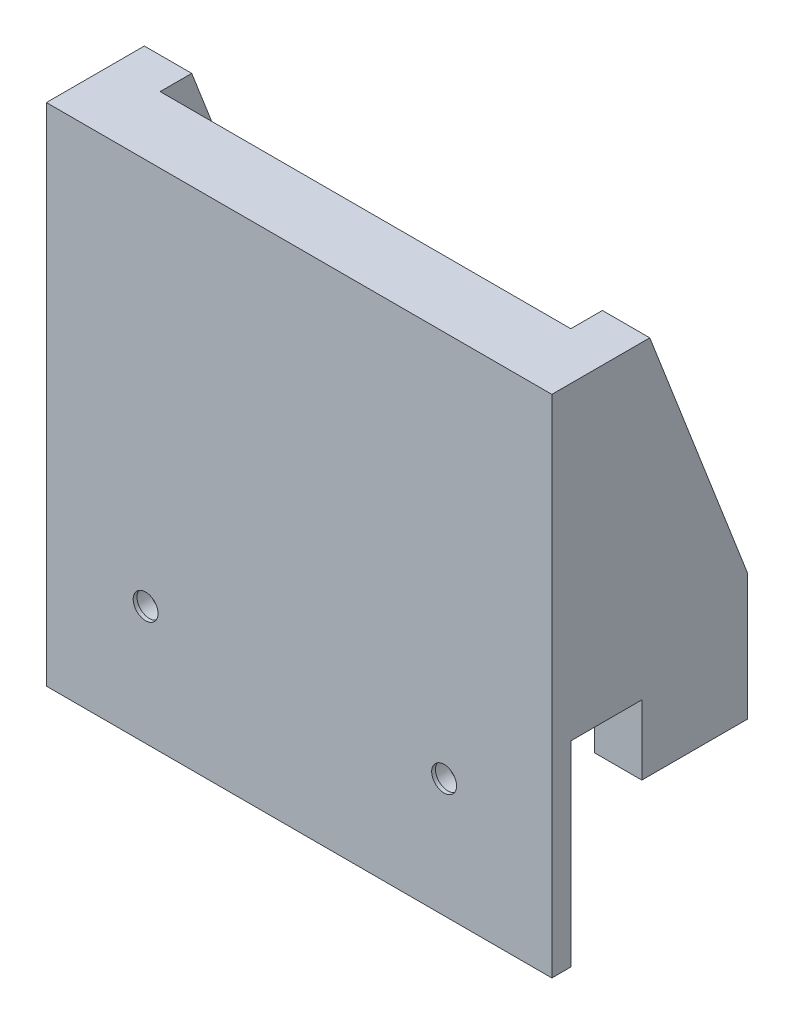
ISO-10303-21;
HEADER;
FILE_DESCRIPTION(('STEP AP214'),'2;1');
FILE_NAME('part.step','',(''),(''),'','','');
FILE_SCHEMA(('AUTOMOTIVE_DESIGN { 1 0 10303 214 1 1 1 1 }'));
ENDSEC;
DATA;
#1=APPLICATION_CONTEXT('core data for automotive mechanical design processes');
#2=APPLICATION_PROTOCOL_DEFINITION('international standard','automotive_design',2000,#1);
#3=PRODUCT_CONTEXT('',#1,'mechanical');
#4=PRODUCT('Part','Part','',(#3));
#5=PRODUCT_RELATED_PRODUCT_CATEGORY('part','',(#4));
#6=PRODUCT_DEFINITION_FORMATION('','',#4);
#7=PRODUCT_DEFINITION_CONTEXT('part definition',#1,'design');
#8=PRODUCT_DEFINITION('design','',#6,#7);
#9=PRODUCT_DEFINITION_SHAPE('','',#8);
#10=(LENGTH_UNIT() NAMED_UNIT(*) SI_UNIT(.MILLI.,.METRE.));
#11=(NAMED_UNIT(*) PLANE_ANGLE_UNIT() SI_UNIT($,.RADIAN.));
#12=(NAMED_UNIT(*) SI_UNIT($,.STERADIAN.) SOLID_ANGLE_UNIT());
#13=UNCERTAINTY_MEASURE_WITH_UNIT(LENGTH_MEASURE(1.E-05),#10,'distance_accuracy_value','');
#14=(GEOMETRIC_REPRESENTATION_CONTEXT(3) GLOBAL_UNCERTAINTY_ASSIGNED_CONTEXT((#13)) GLOBAL_UNIT_ASSIGNED_CONTEXT((#10,
#11,#12)) REPRESENTATION_CONTEXT('',''));
#15=CARTESIAN_POINT('',(0.,0.,0.));
#16=DIRECTION('',(0.,0.,1.));
#17=DIRECTION('',(1.,0.,0.));
#18=AXIS2_PLACEMENT_3D('',#15,#16,#17);
#19=CARTESIAN_POINT('',(0.,0.,-9.525));
#20=DIRECTION('',(0.,0.,-1.));
#21=DIRECTION('',(-1.,0.,0.));
#22=AXIS2_PLACEMENT_3D('',#19,#20,#21);
#23=PLANE('',#22);
#24=DIRECTION('',(-1.,0.,0.));
#25=VECTOR('',#24,1.);
#26=CARTESIAN_POINT('',(0.,39.37,-9.525));
#27=LINE('',#26,#25);
#28=CARTESIAN_POINT('',(-9.525,39.37,-9.525));
#29=VERTEX_POINT('',#28);
#30=CARTESIAN_POINT('',(-92.0749999999996,39.3699999999998,-9.525));
#31=VERTEX_POINT('',#30);
#32=EDGE_CURVE('E58',#29,#31,#27,.T.);
#33=ORIENTED_EDGE('',*,*,#32,.T.);
#34=DIRECTION('',(0.,1.,0.));
#35=VECTOR('',#34,1.);
#36=CARTESIAN_POINT('',(-92.0749999999996,39.37,-9.525));
#37=LINE('',#36,#35);
#38=CARTESIAN_POINT('',(-92.0749999999996,101.6,-9.525));
#39=VERTEX_POINT('',#38);
#40=EDGE_CURVE('E53',#31,#39,#37,.T.);
#41=ORIENTED_EDGE('',*,*,#40,.T.);
#42=DIRECTION('',(1.,0.,0.));
#43=VECTOR('',#42,1.);
#44=CARTESIAN_POINT('',(0.,101.6,-9.525));
#45=LINE('',#44,#43);
#46=CARTESIAN_POINT('',(-9.525,101.6,-9.525));
#47=VERTEX_POINT('',#46);
#48=EDGE_CURVE('E39',#39,#47,#45,.T.);
#49=ORIENTED_EDGE('',*,*,#48,.T.);
#50=DIRECTION('',(0.,-1.,0.));
#51=VECTOR('',#50,1.);
#52=CARTESIAN_POINT('',(-9.525,39.37,-9.525));
#53=LINE('',#52,#51);
#54=EDGE_CURVE('E210',#47,#29,#53,.T.);
#55=ORIENTED_EDGE('',*,*,#54,.T.);
#56=EDGE_LOOP('',(#33,#41,#49,#55));
#57=FACE_BOUND('',#56,.T.);
#58=ADVANCED_FACE('F35',(#57),#23,.T.);
#59=CARTESIAN_POINT('',(-101.6,0.,3.81));
#60=DIRECTION('',(1.,0.,0.));
#61=DIRECTION('',(0.,0.,-1.));
#62=AXIS2_PLACEMENT_3D('',#59,#60,#61);
#63=PLANE('',#62);
#64=DIRECTION('',(0.,0.,-1.));
#65=VECTOR('',#64,1.);
#66=CARTESIAN_POINT('',(-101.6,101.6,3.81));
#67=LINE('',#66,#65);
#68=CARTESIAN_POINT('',(-101.6,101.6,3.81));
#69=VERTEX_POINT('',#68);
#70=CARTESIAN_POINT('',(-101.6,101.6,-15.875));
#71=VERTEX_POINT('',#70);
#72=EDGE_CURVE('E315',#69,#71,#67,.T.);
#73=ORIENTED_EDGE('',*,*,#72,.T.);
#74=DIRECTION('',(0.,-0.93260074364217,-0.360909757360578));
#75=VECTOR('',#74,1.);
#76=CARTESIAN_POINT('',(-101.6,101.6,-15.875));
#77=LINE('',#76,#75);
#78=CARTESIAN_POINT('',(-101.6,50.8,-35.5342333846047));
#79=VERTEX_POINT('',#78);
#80=EDGE_CURVE('E156',#71,#79,#77,.T.);
#81=ORIENTED_EDGE('',*,*,#80,.T.);
#82=DIRECTION('',(0.,-1.,0.));
#83=VECTOR('',#82,1.);
#84=CARTESIAN_POINT('',(-101.6,50.8,-35.5342333846047));
#85=LINE('',#84,#83);
#86=CARTESIAN_POINT('',(-101.6,25.4,-35.5342333846047));
#87=VERTEX_POINT('',#86);
#88=EDGE_CURVE('E187',#79,#87,#85,.T.);
#89=ORIENTED_EDGE('',*,*,#88,.T.);
#90=DIRECTION('',(0.,0.,1.));
#91=VECTOR('',#90,1.);
#92=CARTESIAN_POINT('',(-101.6,25.4,-35.5342333846047));
#93=LINE('',#92,#91);
#94=CARTESIAN_POINT('',(-101.6,25.4,-14.2748));
#95=VERTEX_POINT('',#94);
#96=EDGE_CURVE('E190',#87,#95,#93,.T.);
#97=ORIENTED_EDGE('',*,*,#96,.T.);
#98=DIRECTION('',(0.,1.,0.));
#99=VECTOR('',#98,1.);
#100=CARTESIAN_POINT('',(-101.6,25.4,-14.2748));
#101=LINE('',#100,#99);
#102=CARTESIAN_POINT('',(-101.6,39.37,-14.2748));
#103=VERTEX_POINT('',#102);
#104=EDGE_CURVE('E193',#95,#103,#101,.T.);
#105=ORIENTED_EDGE('',*,*,#104,.T.);
#106=DIRECTION('',(0.,0.,1.));
#107=VECTOR('',#106,1.);
#108=CARTESIAN_POINT('',(-101.6,39.3699999999997,-9.525));
#109=LINE('',#108,#107);
#110=CARTESIAN_POINT('',(-101.6,39.3699999999997,0.));
#111=VERTEX_POINT('',#110);
#112=EDGE_CURVE('E270',#103,#111,#109,.T.);
#113=ORIENTED_EDGE('',*,*,#112,.T.);
#114=DIRECTION('',(0.,-1.,0.));
#115=VECTOR('',#114,1.);
#116=CARTESIAN_POINT('',(-101.6,0.,0.));
#117=LINE('',#116,#115);
#118=CARTESIAN_POINT('',(-101.6,0.,0.));
#119=VERTEX_POINT('',#118);
#120=EDGE_CURVE('E305',#111,#119,#117,.T.);
#121=ORIENTED_EDGE('',*,*,#120,.T.);
#122=DIRECTION('',(0.,0.,-1.));
#123=VECTOR('',#122,1.);
#124=CARTESIAN_POINT('',(-101.6,0.,3.81));
#125=LINE('',#124,#123);
#126=CARTESIAN_POINT('',(-101.6,0.,3.81));
#127=VERTEX_POINT('',#126);
#128=EDGE_CURVE('E11',#127,#119,#125,.T.);
#129=ORIENTED_EDGE('',*,*,#128,.F.);
#130=DIRECTION('',(0.,-1.,0.));
#131=VECTOR('',#130,1.);
#132=CARTESIAN_POINT('',(-101.6,0.,3.81));
#133=LINE('',#132,#131);
#134=EDGE_CURVE('E306',#69,#127,#133,.T.);
#135=ORIENTED_EDGE('',*,*,#134,.F.);
#136=EDGE_LOOP('',(#73,#81,#89,#97,#105,#113,#121,#129,#135));
#137=FACE_BOUND('',#136,.T.);
#138=ADVANCED_FACE('F37',(#137),#63,.F.);
#139=CARTESIAN_POINT('',(-101.6,0.,3.81));
#140=DIRECTION('',(0.,1.,0.));
#141=DIRECTION('',(-1.,0.,0.));
#142=AXIS2_PLACEMENT_3D('',#139,#140,#141);
#143=PLANE('',#142);
#144=DIRECTION('',(1.,0.,0.));
#145=VECTOR('',#144,1.);
#146=CARTESIAN_POINT('',(-101.6,0.,0.));
#147=LINE('',#146,#145);
#148=CARTESIAN_POINT('',(0.,0.,0.));
#149=VERTEX_POINT('',#148);
#150=EDGE_CURVE('E318',#119,#149,#147,.T.);
#151=ORIENTED_EDGE('',*,*,#150,.T.);
#152=DIRECTION('',(0.,0.,-1.));
#153=VECTOR('',#152,1.);
#154=CARTESIAN_POINT('',(0.,0.,3.81));
#155=LINE('',#154,#153);
#156=CARTESIAN_POINT('',(0.,0.,3.81));
#157=VERTEX_POINT('',#156);
#158=EDGE_CURVE('E45',#157,#149,#155,.T.);
#159=ORIENTED_EDGE('',*,*,#158,.F.);
#160=DIRECTION('',(1.,0.,0.));
#161=VECTOR('',#160,1.);
#162=CARTESIAN_POINT('',(-101.6,0.,3.81));
#163=LINE('',#162,#161);
#164=EDGE_CURVE('E309',#127,#157,#163,.T.);
#165=ORIENTED_EDGE('',*,*,#164,.F.);
#166=ORIENTED_EDGE('',*,*,#128,.T.);
#167=EDGE_LOOP('',(#151,#159,#165,#166));
#168=FACE_BOUND('',#167,.T.);
#169=ADVANCED_FACE('F363',(#168),#143,.F.);
#170=CARTESIAN_POINT('',(0.,0.,3.81));
#171=DIRECTION('',(-1.,0.,0.));
#172=DIRECTION('',(0.,0.,1.));
#173=AXIS2_PLACEMENT_3D('',#170,#171,#172);
#174=PLANE('',#173);
#175=DIRECTION('',(0.,1.,0.));
#176=VECTOR('',#175,1.);
#177=CARTESIAN_POINT('',(0.,0.,0.));
#178=LINE('',#177,#176);
#179=CARTESIAN_POINT('',(0.,39.3699999999999,0.));
#180=VERTEX_POINT('',#179);
#181=EDGE_CURVE('E267',#149,#180,#178,.T.);
#182=ORIENTED_EDGE('',*,*,#181,.T.);
#183=DIRECTION('',(0.,0.,1.));
#184=VECTOR('',#183,1.);
#185=CARTESIAN_POINT('',(0.,39.37,-9.525));
#186=LINE('',#185,#184);
#187=CARTESIAN_POINT('',(0.,39.37,-14.2748));
#188=VERTEX_POINT('',#187);
#189=EDGE_CURVE('E273',#188,#180,#186,.T.);
#190=ORIENTED_EDGE('',*,*,#189,.F.);
#191=DIRECTION('',(0.,-1.,0.));
#192=VECTOR('',#191,1.);
#193=CARTESIAN_POINT('',(0.,25.4,-14.2748));
#194=LINE('',#193,#192);
#195=CARTESIAN_POINT('',(0.,25.4,-14.2748));
#196=VERTEX_POINT('',#195);
#197=EDGE_CURVE('E199',#188,#196,#194,.T.);
#198=ORIENTED_EDGE('',*,*,#197,.T.);
#199=DIRECTION('',(0.,0.,-1.));
#200=VECTOR('',#199,1.);
#201=CARTESIAN_POINT('',(0.,25.4,-35.5342333846047));
#202=LINE('',#201,#200);
#203=CARTESIAN_POINT('',(0.,25.4,-35.5342333846047));
#204=VERTEX_POINT('',#203);
#205=EDGE_CURVE('E241',#196,#204,#202,.T.);
#206=ORIENTED_EDGE('',*,*,#205,.T.);
#207=DIRECTION('',(0.,1.,0.));
#208=VECTOR('',#207,1.);
#209=CARTESIAN_POINT('',(0.,50.8,-35.5342333846047));
#210=LINE('',#209,#208);
#211=CARTESIAN_POINT('',(0.,50.8,-35.5342333846047));
#212=VERTEX_POINT('',#211);
#213=EDGE_CURVE('E244',#204,#212,#210,.T.);
#214=ORIENTED_EDGE('',*,*,#213,.T.);
#215=DIRECTION('',(0.,0.93260074364217,0.360909757360578));
#216=VECTOR('',#215,1.);
#217=CARTESIAN_POINT('',(0.,101.6,-15.875));
#218=LINE('',#217,#216);
#219=CARTESIAN_POINT('',(0.,101.6,-15.875));
#220=VERTEX_POINT('',#219);
#221=EDGE_CURVE('E214',#212,#220,#218,.T.);
#222=ORIENTED_EDGE('',*,*,#221,.T.);
#223=DIRECTION('',(0.,0.,-1.));
#224=VECTOR('',#223,1.);
#225=CARTESIAN_POINT('',(0.,101.6,3.81));
#226=LINE('',#225,#224);
#227=CARTESIAN_POINT('',(0.,101.6,3.81));
#228=VERTEX_POINT('',#227);
#229=EDGE_CURVE('E322',#228,#220,#226,.T.);
#230=ORIENTED_EDGE('',*,*,#229,.F.);
#231=DIRECTION('',(0.,1.,0.));
#232=VECTOR('',#231,1.);
#233=CARTESIAN_POINT('',(0.,0.,3.81));
#234=LINE('',#233,#232);
#235=EDGE_CURVE('E311',#157,#228,#234,.T.);
#236=ORIENTED_EDGE('',*,*,#235,.F.);
#237=ORIENTED_EDGE('',*,*,#158,.T.);
#238=EDGE_LOOP('',(#182,#190,#198,#206,#214,#222,#230,#236,#237));
#239=FACE_BOUND('',#238,.T.);
#240=ADVANCED_FACE('F336',(#239),#174,.F.);
#241=CARTESIAN_POINT('',(-101.6,101.6,3.81));
#242=DIRECTION('',(0.,-1.,0.));
#243=DIRECTION('',(0.,0.,-1.));
#244=AXIS2_PLACEMENT_3D('',#241,#242,#243);
#245=PLANE('',#244);
#246=ORIENTED_EDGE('',*,*,#229,.T.);
#247=DIRECTION('',(1.,0.,0.));
#248=VECTOR('',#247,1.);
#249=CARTESIAN_POINT('',(-9.525,101.6,-15.875));
#250=LINE('',#249,#248);
#251=CARTESIAN_POINT('',(-9.525,101.6,-15.875));
#252=VERTEX_POINT('',#251);
#253=EDGE_CURVE('E249',#252,#220,#250,.T.);
#254=ORIENTED_EDGE('',*,*,#253,.F.);
#255=DIRECTION('',(0.,0.,1.));
#256=VECTOR('',#255,1.);
#257=CARTESIAN_POINT('',(-9.525,101.6,-9.525));
#258=LINE('',#257,#256);
#259=EDGE_CURVE('E221',#252,#47,#258,.T.);
#260=ORIENTED_EDGE('',*,*,#259,.T.);
#261=ORIENTED_EDGE('',*,*,#48,.F.);
#262=DIRECTION('',(0.,0.,-1.));
#263=VECTOR('',#262,1.);
#264=CARTESIAN_POINT('',(-92.0749999999996,101.6,-9.525));
#265=LINE('',#264,#263);
#266=CARTESIAN_POINT('',(-92.0749999999996,101.6,-15.875));
#267=VERTEX_POINT('',#266);
#268=EDGE_CURVE('E168',#39,#267,#265,.T.);
#269=ORIENTED_EDGE('',*,*,#268,.T.);
#270=DIRECTION('',(-1.,0.,0.));
#271=VECTOR('',#270,1.);
#272=CARTESIAN_POINT('',(-92.0749999999996,101.6,-15.875));
#273=LINE('',#272,#271);
#274=EDGE_CURVE('E151',#267,#71,#273,.T.);
#275=ORIENTED_EDGE('',*,*,#274,.T.);
#276=ORIENTED_EDGE('',*,*,#72,.F.);
#277=DIRECTION('',(-1.,0.,0.));
#278=VECTOR('',#277,1.);
#279=CARTESIAN_POINT('',(-101.6,101.6,3.81));
#280=LINE('',#279,#278);
#281=EDGE_CURVE('E313',#228,#69,#280,.T.);
#282=ORIENTED_EDGE('',*,*,#281,.F.);
#283=EDGE_LOOP('',(#246,#254,#260,#261,#269,#275,#276,#282));
#284=FACE_BOUND('',#283,.T.);
#285=ADVANCED_FACE('F173',(#284),#245,.F.);
#286=CARTESIAN_POINT('',(0.,0.,3.81));
#287=DIRECTION('',(0.,0.,-1.));
#288=DIRECTION('',(-1.,0.,0.));
#289=AXIS2_PLACEMENT_3D('',#286,#287,#288);
#290=PLANE('',#289);
#291=CARTESIAN_POINT('',(-21.6569926395346,23.8648844244175,3.81));
#292=DIRECTION('',(0.,0.,-1.));
#293=DIRECTION('',(-1.,0.,0.));
#294=AXIS2_PLACEMENT_3D('',#291,#292,#293);
#295=CIRCLE('',#294,2.5);
#296=CARTESIAN_POINT('',(-24.1569926395346,23.8648844244175,3.81));
#297=VERTEX_POINT('',#296);
#298=EDGE_CURVE('E288',#297,#297,#295,.T.);
#299=ORIENTED_EDGE('',*,*,#298,.T.);
#300=EDGE_LOOP('',(#299));
#301=FACE_BOUND('',#300,.T.);
#302=CARTESIAN_POINT('',(-81.6598930743401,23.8648844244175,3.81));
#303=DIRECTION('',(0.,0.,-1.));
#304=DIRECTION('',(-1.,0.,0.));
#305=AXIS2_PLACEMENT_3D('',#302,#303,#304);
#306=CIRCLE('',#305,2.5);
#307=CARTESIAN_POINT('',(-84.1598930743401,23.8648844244175,3.81));
#308=VERTEX_POINT('',#307);
#309=EDGE_CURVE('E302',#308,#308,#306,.T.);
#310=ORIENTED_EDGE('',*,*,#309,.T.);
#311=EDGE_LOOP('',(#310));
#312=FACE_BOUND('',#311,.T.);
#313=ORIENTED_EDGE('',*,*,#134,.T.);
#314=ORIENTED_EDGE('',*,*,#164,.T.);
#315=ORIENTED_EDGE('',*,*,#235,.T.);
#316=ORIENTED_EDGE('',*,*,#281,.T.);
#317=EDGE_LOOP('',(#313,#314,#315,#316));
#318=FACE_BOUND('',#317,.T.);
#319=ADVANCED_FACE('F331',(#301,#312,#318),#290,.F.);
#320=CARTESIAN_POINT('',(0.,0.,0.));
#321=DIRECTION('',(0.,0.,-1.));
#322=DIRECTION('',(-1.,0.,0.));
#323=AXIS2_PLACEMENT_3D('',#320,#321,#322);
#324=PLANE('',#323);
#325=DIRECTION('',(-1.,0.,0.));
#326=VECTOR('',#325,1.);
#327=CARTESIAN_POINT('',(0.,39.37,0.));
#328=LINE('',#327,#326);
#329=EDGE_CURVE('E251',#180,#111,#328,.T.);
#330=ORIENTED_EDGE('',*,*,#329,.F.);
#331=ORIENTED_EDGE('',*,*,#181,.F.);
#332=ORIENTED_EDGE('',*,*,#150,.F.);
#333=ORIENTED_EDGE('',*,*,#120,.F.);
#334=EDGE_LOOP('',(#330,#331,#332,#333));
#335=FACE_BOUND('',#334,.T.);
#336=CARTESIAN_POINT('',(-21.6569926395346,23.8648844244175,0.));
#337=DIRECTION('',(0.,0.,-1.));
#338=DIRECTION('',(-1.,0.,0.));
#339=AXIS2_PLACEMENT_3D('',#336,#337,#338);
#340=CIRCLE('',#339,3.);
#341=CARTESIAN_POINT('',(-24.6569926395346,23.8648844244175,0.));
#342=VERTEX_POINT('',#341);
#343=EDGE_CURVE('E261',#342,#342,#340,.T.);
#344=ORIENTED_EDGE('',*,*,#343,.F.);
#345=EDGE_LOOP('',(#344));
#346=FACE_BOUND('',#345,.T.);
#347=CARTESIAN_POINT('',(-81.6598930743401,23.8648844244175,0.));
#348=DIRECTION('',(0.,0.,-1.));
#349=DIRECTION('',(-1.,0.,0.));
#350=AXIS2_PLACEMENT_3D('',#347,#348,#349);
#351=CIRCLE('',#350,2.99999999999999);
#352=CARTESIAN_POINT('',(-84.6598930743401,23.8648844244175,0.));
#353=VERTEX_POINT('',#352);
#354=EDGE_CURVE('E293',#353,#353,#351,.T.);
#355=ORIENTED_EDGE('',*,*,#354,.F.);
#356=EDGE_LOOP('',(#355));
#357=FACE_BOUND('',#356,.T.);
#358=ADVANCED_FACE('F392',(#335,#346,#357),#324,.T.);
#359=CARTESIAN_POINT('',(-81.6598930743401,23.8648844244175,0.));
#360=DIRECTION('',(0.,0.,-1.));
#361=DIRECTION('',(-1.,0.,0.));
#362=AXIS2_PLACEMENT_3D('',#359,#360,#361);
#363=CYLINDRICAL_SURFACE('',#362,2.5);
#364=ORIENTED_EDGE('',*,*,#309,.F.);
#365=EDGE_LOOP('',(#364));
#366=FACE_BOUND('',#365,.T.);
#367=CARTESIAN_POINT('',(-81.6598930743401,23.8648844244175,3.048));
#368=DIRECTION('',(0.,0.,-1.));
#369=DIRECTION('',(-1.,0.,0.));
#370=AXIS2_PLACEMENT_3D('',#367,#368,#369);
#371=CIRCLE('',#370,2.5);
#372=CARTESIAN_POINT('',(-84.1598930743401,23.8648844244175,3.048));
#373=VERTEX_POINT('',#372);
#374=EDGE_CURVE('E299',#373,#373,#371,.T.);
#375=ORIENTED_EDGE('',*,*,#374,.T.);
#376=EDGE_LOOP('',(#375));
#377=FACE_BOUND('',#376,.T.);
#378=ADVANCED_FACE('F388',(#366,#377),#363,.F.);
#379=CARTESIAN_POINT('',(-79.1598930743401,23.8648844244175,3.048));
#380=DIRECTION('',(0.,0.,1.));
#381=DIRECTION('',(1.,0.,0.));
#382=AXIS2_PLACEMENT_3D('',#379,#380,#381);
#383=PLANE('',#382);
#384=ORIENTED_EDGE('',*,*,#374,.F.);
#385=EDGE_LOOP('',(#384));
#386=FACE_BOUND('',#385,.T.);
#387=CARTESIAN_POINT('',(-81.6598930743401,23.8648844244175,3.048));
#388=DIRECTION('',(0.,0.,-1.));
#389=DIRECTION('',(-1.,0.,0.));
#390=AXIS2_PLACEMENT_3D('',#387,#388,#389);
#391=CIRCLE('',#390,3.);
#392=CARTESIAN_POINT('',(-84.6598930743401,23.8648844244175,3.048));
#393=VERTEX_POINT('',#392);
#394=EDGE_CURVE('E296',#393,#393,#391,.T.);
#395=ORIENTED_EDGE('',*,*,#394,.T.);
#396=EDGE_LOOP('',(#395));
#397=FACE_BOUND('',#396,.T.);
#398=ADVANCED_FACE('F384',(#386,#397),#383,.F.);
#399=CARTESIAN_POINT('',(-81.6598930743401,23.8648844244175,0.));
#400=DIRECTION('',(0.,0.,-1.));
#401=DIRECTION('',(-1.,0.,0.));
#402=AXIS2_PLACEMENT_3D('',#399,#400,#401);
#403=CYLINDRICAL_SURFACE('',#402,3.);
#404=ORIENTED_EDGE('',*,*,#394,.F.);
#405=EDGE_LOOP('',(#404));
#406=FACE_BOUND('',#405,.T.);
#407=ORIENTED_EDGE('',*,*,#354,.T.);
#408=EDGE_LOOP('',(#407));
#409=FACE_BOUND('',#408,.T.);
#410=ADVANCED_FACE('F380',(#406,#409),#403,.F.);
#411=CARTESIAN_POINT('',(-21.6569926395346,23.8648844244175,0.));
#412=DIRECTION('',(0.,0.,-1.));
#413=DIRECTION('',(-1.,0.,0.));
#414=AXIS2_PLACEMENT_3D('',#411,#412,#413);
#415=CYLINDRICAL_SURFACE('',#414,2.5);
#416=ORIENTED_EDGE('',*,*,#298,.F.);
#417=EDGE_LOOP('',(#416));
#418=FACE_BOUND('',#417,.T.);
#419=CARTESIAN_POINT('',(-21.6569926395346,23.8648844244175,3.048));
#420=DIRECTION('',(0.,0.,-1.));
#421=DIRECTION('',(-1.,0.,0.));
#422=AXIS2_PLACEMENT_3D('',#419,#420,#421);
#423=CIRCLE('',#422,2.5);
#424=CARTESIAN_POINT('',(-24.1569926395346,23.8648844244175,3.048));
#425=VERTEX_POINT('',#424);
#426=EDGE_CURVE('E284',#425,#425,#423,.T.);
#427=ORIENTED_EDGE('',*,*,#426,.T.);
#428=EDGE_LOOP('',(#427));
#429=FACE_BOUND('',#428,.T.);
#430=ADVANCED_FACE('F376',(#418,#429),#415,.F.);
#431=CARTESIAN_POINT('',(-19.1569926395347,23.8648844244175,3.048));
#432=DIRECTION('',(0.,0.,1.));
#433=DIRECTION('',(1.,0.,0.));
#434=AXIS2_PLACEMENT_3D('',#431,#432,#433);
#435=PLANE('',#434);
#436=ORIENTED_EDGE('',*,*,#426,.F.);
#437=EDGE_LOOP('',(#436));
#438=FACE_BOUND('',#437,.T.);
#439=CARTESIAN_POINT('',(-21.6569926395346,23.8648844244175,3.048));
#440=DIRECTION('',(0.,0.,-1.));
#441=DIRECTION('',(-1.,0.,0.));
#442=AXIS2_PLACEMENT_3D('',#439,#440,#441);
#443=CIRCLE('',#442,3.);
#444=CARTESIAN_POINT('',(-24.6569926395347,23.8648844244175,3.048));
#445=VERTEX_POINT('',#444);
#446=EDGE_CURVE('E280',#445,#445,#443,.T.);
#447=ORIENTED_EDGE('',*,*,#446,.T.);
#448=EDGE_LOOP('',(#447));
#449=FACE_BOUND('',#448,.T.);
#450=ADVANCED_FACE('F372',(#438,#449),#435,.F.);
#451=CARTESIAN_POINT('',(-21.6569926395346,23.8648844244175,0.));
#452=DIRECTION('',(0.,0.,-1.));
#453=DIRECTION('',(-1.,0.,0.));
#454=AXIS2_PLACEMENT_3D('',#451,#452,#453);
#455=CYLINDRICAL_SURFACE('',#454,3.);
#456=ORIENTED_EDGE('',*,*,#446,.F.);
#457=EDGE_LOOP('',(#456));
#458=FACE_BOUND('',#457,.T.);
#459=ORIENTED_EDGE('',*,*,#343,.T.);
#460=EDGE_LOOP('',(#459));
#461=FACE_BOUND('',#460,.T.);
#462=ADVANCED_FACE('F369',(#458,#461),#455,.F.);
#463=CARTESIAN_POINT('',(0.,39.37,-9.525));
#464=DIRECTION('',(0.,1.,0.));
#465=DIRECTION('',(-1.,0.,0.));
#466=AXIS2_PLACEMENT_3D('',#463,#464,#465);
#467=PLANE('',#466);
#468=ORIENTED_EDGE('',*,*,#329,.T.);
#469=ORIENTED_EDGE('',*,*,#112,.F.);
#470=DIRECTION('',(-1.,0.,0.));
#471=VECTOR('',#470,1.);
#472=CARTESIAN_POINT('',(-92.0749999999996,39.37,-14.2748));
#473=LINE('',#472,#471);
#474=CARTESIAN_POINT('',(-92.0749999999996,39.37,-14.2748));
#475=VERTEX_POINT('',#474);
#476=EDGE_CURVE('E196',#475,#103,#473,.T.);
#477=ORIENTED_EDGE('',*,*,#476,.F.);
#478=DIRECTION('',(0.,0.,1.));
#479=VECTOR('',#478,1.);
#480=CARTESIAN_POINT('',(-92.0749999999996,39.37,-14.2748));
#481=LINE('',#480,#479);
#482=EDGE_CURVE('E176',#475,#31,#481,.T.);
#483=ORIENTED_EDGE('',*,*,#482,.T.);
#484=ORIENTED_EDGE('',*,*,#32,.F.);
#485=DIRECTION('',(0.,0.,-1.));
#486=VECTOR('',#485,1.);
#487=CARTESIAN_POINT('',(-9.525,39.37,-14.2748));
#488=LINE('',#487,#486);
#489=CARTESIAN_POINT('',(-9.525,39.37,-14.2748));
#490=VERTEX_POINT('',#489);
#491=EDGE_CURVE('E213',#29,#490,#488,.T.);
#492=ORIENTED_EDGE('',*,*,#491,.T.);
#493=DIRECTION('',(1.,0.,0.));
#494=VECTOR('',#493,1.);
#495=CARTESIAN_POINT('',(-9.525,39.37,-14.2748));
#496=LINE('',#495,#494);
#497=EDGE_CURVE('E222',#490,#188,#496,.T.);
#498=ORIENTED_EDGE('',*,*,#497,.T.);
#499=ORIENTED_EDGE('',*,*,#189,.T.);
#500=EDGE_LOOP('',(#468,#469,#477,#483,#484,#492,#498,#499));
#501=FACE_BOUND('',#500,.T.);
#502=ADVANCED_FACE('F356',(#501),#467,.F.);
#503=CARTESIAN_POINT('',(-9.525,101.6,-15.875));
#504=DIRECTION('',(0.,0.360909757360578,-0.93260074364217));
#505=DIRECTION('',(0.,0.93260074364217,0.360909757360578));
#506=AXIS2_PLACEMENT_3D('',#503,#504,#505);
#507=PLANE('',#506);
#508=ORIENTED_EDGE('',*,*,#221,.F.);
#509=DIRECTION('',(1.,0.,0.));
#510=VECTOR('',#509,1.);
#511=CARTESIAN_POINT('',(-9.525,50.8,-35.5342333846047));
#512=LINE('',#511,#510);
#513=CARTESIAN_POINT('',(-9.525,50.8,-35.5342333846047));
#514=VERTEX_POINT('',#513);
#515=EDGE_CURVE('E252',#514,#212,#512,.T.);
#516=ORIENTED_EDGE('',*,*,#515,.F.);
#517=DIRECTION('',(0.,0.93260074364217,0.360909757360578));
#518=VECTOR('',#517,1.);
#519=CARTESIAN_POINT('',(-9.525,101.6,-15.875));
#520=LINE('',#519,#518);
#521=EDGE_CURVE('E223',#514,#252,#520,.T.);
#522=ORIENTED_EDGE('',*,*,#521,.T.);
#523=ORIENTED_EDGE('',*,*,#253,.T.);
#524=EDGE_LOOP('',(#508,#516,#522,#523));
#525=FACE_BOUND('',#524,.T.);
#526=ADVANCED_FACE('F339',(#525),#507,.T.);
#527=CARTESIAN_POINT('',(-9.525,50.8,-35.5342333846047));
#528=DIRECTION('',(0.,0.,-1.));
#529=DIRECTION('',(-1.,0.,0.));
#530=AXIS2_PLACEMENT_3D('',#527,#528,#529);
#531=PLANE('',#530);
#532=ORIENTED_EDGE('',*,*,#213,.F.);
#533=DIRECTION('',(1.,0.,0.));
#534=VECTOR('',#533,1.);
#535=CARTESIAN_POINT('',(-9.525,25.4,-35.5342333846047));
#536=LINE('',#535,#534);
#537=CARTESIAN_POINT('',(-9.525,25.4,-35.5342333846047));
#538=VERTEX_POINT('',#537);
#539=EDGE_CURVE('E254',#538,#204,#536,.T.);
#540=ORIENTED_EDGE('',*,*,#539,.F.);
#541=DIRECTION('',(0.,1.,0.));
#542=VECTOR('',#541,1.);
#543=CARTESIAN_POINT('',(-9.525,50.8,-35.5342333846047));
#544=LINE('',#543,#542);
#545=EDGE_CURVE('E230',#538,#514,#544,.T.);
#546=ORIENTED_EDGE('',*,*,#545,.T.);
#547=ORIENTED_EDGE('',*,*,#515,.T.);
#548=EDGE_LOOP('',(#532,#540,#546,#547));
#549=FACE_BOUND('',#548,.T.);
#550=ADVANCED_FACE('F347',(#549),#531,.T.);
#551=CARTESIAN_POINT('',(-9.525,25.4,-35.5342333846047));
#552=DIRECTION('',(0.,-1.,0.));
#553=DIRECTION('',(0.,0.,-1.));
#554=AXIS2_PLACEMENT_3D('',#551,#552,#553);
#555=PLANE('',#554);
#556=ORIENTED_EDGE('',*,*,#205,.F.);
#557=DIRECTION('',(1.,0.,0.));
#558=VECTOR('',#557,1.);
#559=CARTESIAN_POINT('',(-9.525,25.4,-14.2748));
#560=LINE('',#559,#558);
#561=CARTESIAN_POINT('',(-9.525,25.4,-14.2748));
#562=VERTEX_POINT('',#561);
#563=EDGE_CURVE('E227',#562,#196,#560,.T.);
#564=ORIENTED_EDGE('',*,*,#563,.F.);
#565=DIRECTION('',(0.,0.,-1.));
#566=VECTOR('',#565,1.);
#567=CARTESIAN_POINT('',(-9.525,25.4,-35.5342333846047));
#568=LINE('',#567,#566);
#569=EDGE_CURVE('E236',#562,#538,#568,.T.);
#570=ORIENTED_EDGE('',*,*,#569,.T.);
#571=ORIENTED_EDGE('',*,*,#539,.T.);
#572=EDGE_LOOP('',(#556,#564,#570,#571));
#573=FACE_BOUND('',#572,.T.);
#574=ADVANCED_FACE('F350',(#573),#555,.T.);
#575=CARTESIAN_POINT('',(-9.525,25.4,-14.2748));
#576=DIRECTION('',(0.,0.,1.));
#577=DIRECTION('',(1.,0.,0.));
#578=AXIS2_PLACEMENT_3D('',#575,#576,#577);
#579=PLANE('',#578);
#580=ORIENTED_EDGE('',*,*,#197,.F.);
#581=ORIENTED_EDGE('',*,*,#497,.F.);
#582=DIRECTION('',(0.,-1.,0.));
#583=VECTOR('',#582,1.);
#584=CARTESIAN_POINT('',(-9.525,25.4,-14.2748));
#585=LINE('',#584,#583);
#586=EDGE_CURVE('E207',#490,#562,#585,.T.);
#587=ORIENTED_EDGE('',*,*,#586,.T.);
#588=ORIENTED_EDGE('',*,*,#563,.T.);
#589=EDGE_LOOP('',(#580,#581,#587,#588));
#590=FACE_BOUND('',#589,.T.);
#591=ADVANCED_FACE('F355',(#590),#579,.T.);
#592=CARTESIAN_POINT('',(-9.525,0.,0.));
#593=DIRECTION('',(-1.,0.,0.));
#594=DIRECTION('',(0.,0.,1.));
#595=AXIS2_PLACEMENT_3D('',#592,#593,#594);
#596=PLANE('',#595);
#597=ORIENTED_EDGE('',*,*,#54,.F.);
#598=ORIENTED_EDGE('',*,*,#259,.F.);
#599=ORIENTED_EDGE('',*,*,#521,.F.);
#600=ORIENTED_EDGE('',*,*,#545,.F.);
#601=ORIENTED_EDGE('',*,*,#569,.F.);
#602=ORIENTED_EDGE('',*,*,#586,.F.);
#603=ORIENTED_EDGE('',*,*,#491,.F.);
#604=EDGE_LOOP('',(#597,#598,#599,#600,#601,#602,#603));
#605=FACE_BOUND('',#604,.T.);
#606=ADVANCED_FACE('F344',(#605),#596,.T.);
#607=CARTESIAN_POINT('',(-92.0749999999996,25.4,-14.2748));
#608=DIRECTION('',(0.,0.,1.));
#609=DIRECTION('',(1.,0.,0.));
#610=AXIS2_PLACEMENT_3D('',#607,#608,#609);
#611=PLANE('',#610);
#612=ORIENTED_EDGE('',*,*,#104,.F.);
#613=DIRECTION('',(-1.,0.,0.));
#614=VECTOR('',#613,1.);
#615=CARTESIAN_POINT('',(-92.0749999999996,25.4,-14.2748));
#616=LINE('',#615,#614);
#617=CARTESIAN_POINT('',(-92.0749999999996,25.4,-14.2748));
#618=VERTEX_POINT('',#617);
#619=EDGE_CURVE('E200',#618,#95,#616,.T.);
#620=ORIENTED_EDGE('',*,*,#619,.F.);
#621=DIRECTION('',(0.,1.,0.));
#622=VECTOR('',#621,1.);
#623=CARTESIAN_POINT('',(-92.0749999999996,25.4,-14.2748));
#624=LINE('',#623,#622);
#625=EDGE_CURVE('E161',#618,#475,#624,.T.);
#626=ORIENTED_EDGE('',*,*,#625,.T.);
#627=ORIENTED_EDGE('',*,*,#476,.T.);
#628=EDGE_LOOP('',(#612,#620,#626,#627));
#629=FACE_BOUND('',#628,.T.);
#630=ADVANCED_FACE('F413',(#629),#611,.T.);
#631=CARTESIAN_POINT('',(-92.0749999999996,25.4,-35.5342333846047));
#632=DIRECTION('',(0.,-1.,0.));
#633=DIRECTION('',(0.,0.,-1.));
#634=AXIS2_PLACEMENT_3D('',#631,#632,#633);
#635=PLANE('',#634);
#636=ORIENTED_EDGE('',*,*,#96,.F.);
#637=DIRECTION('',(-1.,0.,0.));
#638=VECTOR('',#637,1.);
#639=CARTESIAN_POINT('',(-92.0749999999996,25.4,-35.5342333846047));
#640=LINE('',#639,#638);
#641=CARTESIAN_POINT('',(-92.0749999999996,25.4,-35.5342333846047));
#642=VERTEX_POINT('',#641);
#643=EDGE_CURVE('E202',#642,#87,#640,.T.);
#644=ORIENTED_EDGE('',*,*,#643,.F.);
#645=DIRECTION('',(0.,0.,1.));
#646=VECTOR('',#645,1.);
#647=CARTESIAN_POINT('',(-92.0749999999996,25.4,-35.5342333846047));
#648=LINE('',#647,#646);
#649=EDGE_CURVE('E181',#642,#618,#648,.T.);
#650=ORIENTED_EDGE('',*,*,#649,.T.);
#651=ORIENTED_EDGE('',*,*,#619,.T.);
#652=EDGE_LOOP('',(#636,#644,#650,#651));
#653=FACE_BOUND('',#652,.T.);
#654=ADVANCED_FACE('F419',(#653),#635,.T.);
#655=CARTESIAN_POINT('',(-92.0749999999996,50.8,-35.5342333846047));
#656=DIRECTION('',(0.,0.,-1.));
#657=DIRECTION('',(-1.,0.,0.));
#658=AXIS2_PLACEMENT_3D('',#655,#656,#657);
#659=PLANE('',#658);
#660=ORIENTED_EDGE('',*,*,#88,.F.);
#661=DIRECTION('',(-1.,0.,0.));
#662=VECTOR('',#661,1.);
#663=CARTESIAN_POINT('',(-92.0749999999996,50.8,-35.5342333846047));
#664=LINE('',#663,#662);
#665=CARTESIAN_POINT('',(-92.0749999999996,50.8,-35.5342333846047));
#666=VERTEX_POINT('',#665);
#667=EDGE_CURVE('E160',#666,#79,#664,.T.);
#668=ORIENTED_EDGE('',*,*,#667,.F.);
#669=DIRECTION('',(0.,-1.,0.));
#670=VECTOR('',#669,1.);
#671=CARTESIAN_POINT('',(-92.0749999999996,50.8,-35.5342333846047));
#672=LINE('',#671,#670);
#673=EDGE_CURVE('E171',#666,#642,#672,.T.);
#674=ORIENTED_EDGE('',*,*,#673,.T.);
#675=ORIENTED_EDGE('',*,*,#643,.T.);
#676=EDGE_LOOP('',(#660,#668,#674,#675));
#677=FACE_BOUND('',#676,.T.);
#678=ADVANCED_FACE('F418',(#677),#659,.T.);
#679=CARTESIAN_POINT('',(-92.0749999999996,101.6,-15.875));
#680=DIRECTION('',(0.,0.360909757360578,-0.93260074364217));
#681=DIRECTION('',(0.,0.93260074364217,0.360909757360578));
#682=AXIS2_PLACEMENT_3D('',#679,#680,#681);
#683=PLANE('',#682);
#684=ORIENTED_EDGE('',*,*,#80,.F.);
#685=ORIENTED_EDGE('',*,*,#274,.F.);
#686=DIRECTION('',(0.,-0.93260074364217,-0.360909757360578));
#687=VECTOR('',#686,1.);
#688=CARTESIAN_POINT('',(-92.0749999999996,101.6,-15.875));
#689=LINE('',#688,#687);
#690=EDGE_CURVE('E154',#267,#666,#689,.T.);
#691=ORIENTED_EDGE('',*,*,#690,.T.);
#692=ORIENTED_EDGE('',*,*,#667,.T.);
#693=EDGE_LOOP('',(#684,#685,#691,#692));
#694=FACE_BOUND('',#693,.T.);
#695=ADVANCED_FACE('F153',(#694),#683,.T.);
#696=CARTESIAN_POINT('',(-92.0749999999996,0.,0.));
#697=DIRECTION('',(-1.,0.,0.));
#698=DIRECTION('',(0.,0.,1.));
#699=AXIS2_PLACEMENT_3D('',#696,#697,#698);
#700=PLANE('',#699);
#701=ORIENTED_EDGE('',*,*,#482,.F.);
#702=ORIENTED_EDGE('',*,*,#625,.F.);
#703=ORIENTED_EDGE('',*,*,#649,.F.);
#704=ORIENTED_EDGE('',*,*,#673,.F.);
#705=ORIENTED_EDGE('',*,*,#690,.F.);
#706=ORIENTED_EDGE('',*,*,#268,.F.);
#707=ORIENTED_EDGE('',*,*,#40,.F.);
#708=EDGE_LOOP('',(#701,#702,#703,#704,#705,#706,#707));
#709=FACE_BOUND('',#708,.T.);
#710=ADVANCED_FACE('F167',(#709),#700,.F.);
#711=CLOSED_SHELL('',(#58,#138,#169,#240,#285,#319,#358,#378,#398,#410,#430,#450,#462,#502,#526,
#550,#574,#591,#606,#630,#654,#678,#695,#710));
#712=MANIFOLD_SOLID_BREP('B2',#711);
#713=ADVANCED_BREP_SHAPE_REPRESENTATION('',(#18,#712),#14);
#714=SHAPE_DEFINITION_REPRESENTATION(#9,#713);
ENDSEC;
END-ISO-10303-21;
